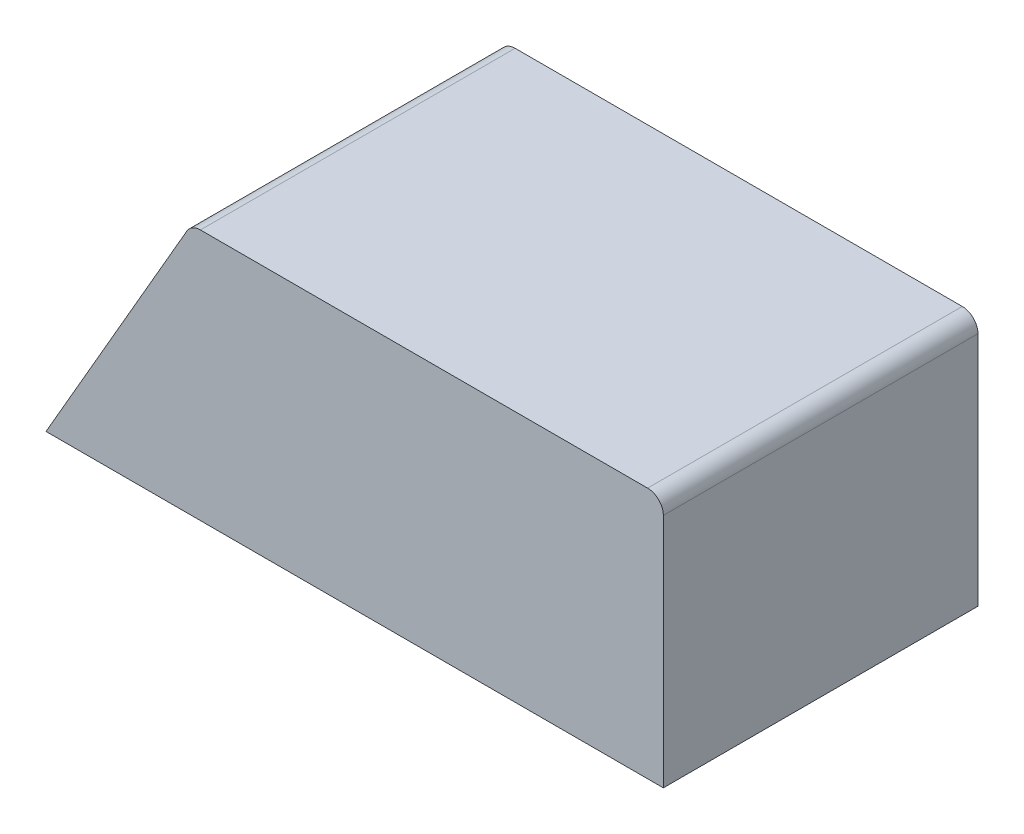
ISO-10303-21;
HEADER;
FILE_DESCRIPTION(('STEP AP214'),'2;1');
FILE_NAME('part.step','',(''),(''),'','','');
FILE_SCHEMA(('AUTOMOTIVE_DESIGN { 1 0 10303 214 1 1 1 1 }'));
ENDSEC;
DATA;
#1=APPLICATION_CONTEXT('core data for automotive mechanical design processes');
#2=APPLICATION_PROTOCOL_DEFINITION('international standard','automotive_design',2000,#1);
#3=PRODUCT_CONTEXT('',#1,'mechanical');
#4=PRODUCT('Part','Part','',(#3));
#5=PRODUCT_RELATED_PRODUCT_CATEGORY('part','',(#4));
#6=PRODUCT_DEFINITION_FORMATION('','',#4);
#7=PRODUCT_DEFINITION_CONTEXT('part definition',#1,'design');
#8=PRODUCT_DEFINITION('design','',#6,#7);
#9=PRODUCT_DEFINITION_SHAPE('','',#8);
#10=(LENGTH_UNIT() NAMED_UNIT(*) SI_UNIT(.MILLI.,.METRE.));
#11=(NAMED_UNIT(*) PLANE_ANGLE_UNIT() SI_UNIT($,.RADIAN.));
#12=(NAMED_UNIT(*) SI_UNIT($,.STERADIAN.) SOLID_ANGLE_UNIT());
#13=UNCERTAINTY_MEASURE_WITH_UNIT(LENGTH_MEASURE(1.E-05),#10,'distance_accuracy_value','');
#14=(GEOMETRIC_REPRESENTATION_CONTEXT(3) GLOBAL_UNCERTAINTY_ASSIGNED_CONTEXT((#13)) GLOBAL_UNIT_ASSIGNED_CONTEXT((#10,
#11,#12)) REPRESENTATION_CONTEXT('',''));
#15=CARTESIAN_POINT('',(0.,0.,0.));
#16=DIRECTION('',(0.,0.,1.));
#17=DIRECTION('',(1.,0.,0.));
#18=AXIS2_PLACEMENT_3D('',#15,#16,#17);
#19=CARTESIAN_POINT('',(-19.618802153517,0.,5.));
#20=DIRECTION('',(0.86602540378444,-0.499999999999998,0.));
#21=DIRECTION('',(0.499999999999998,0.86602540378444,0.));
#22=AXIS2_PLACEMENT_3D('',#19,#20,#21);
#23=PLANE('',#22);
#24=DIRECTION('',(-0.499999999999998,-0.86602540378444,0.));
#25=VECTOR('',#24,1.);
#26=CARTESIAN_POINT('',(-19.618802153517,0.,5.));
#27=LINE('',#26,#25);
#28=CARTESIAN_POINT('',(-15.1443375672974,7.75,5.));
#29=VERTEX_POINT('',#28);
#30=CARTESIAN_POINT('',(-19.618802153517,0.,5.));
#31=VERTEX_POINT('',#30);
#32=EDGE_CURVE('E87',#29,#31,#27,.T.);
#33=ORIENTED_EDGE('',*,*,#32,.F.);
#34=DIRECTION('',(0.,0.,-1.));
#35=VECTOR('',#34,1.);
#36=CARTESIAN_POINT('',(-15.1443375672974,7.75,5.));
#37=LINE('',#36,#35);
#38=CARTESIAN_POINT('',(-15.1443375672974,7.75,-5.));
#39=VERTEX_POINT('',#38);
#40=EDGE_CURVE('E11',#29,#39,#37,.T.);
#41=ORIENTED_EDGE('',*,*,#40,.T.);
#42=DIRECTION('',(-0.499999999999998,-0.86602540378444,0.));
#43=VECTOR('',#42,1.);
#44=CARTESIAN_POINT('',(-19.618802153517,0.,-5.));
#45=LINE('',#44,#43);
#46=CARTESIAN_POINT('',(-19.618802153517,0.,-5.));
#47=VERTEX_POINT('',#46);
#48=EDGE_CURVE('E106',#39,#47,#45,.T.);
#49=ORIENTED_EDGE('',*,*,#48,.T.);
#50=DIRECTION('',(0.,0.,-1.));
#51=VECTOR('',#50,1.);
#52=CARTESIAN_POINT('',(-19.618802153517,0.,5.));
#53=LINE('',#52,#51);
#54=EDGE_CURVE('E100',#31,#47,#53,.T.);
#55=ORIENTED_EDGE('',*,*,#54,.F.);
#56=EDGE_LOOP('',(#33,#41,#49,#55));
#57=FACE_BOUND('',#56,.T.);
#58=ADVANCED_FACE('F34',(#57),#23,.F.);
#59=CARTESIAN_POINT('',(0.,0.,5.));
#60=DIRECTION('',(0.,1.,0.));
#61=DIRECTION('',(-1.,0.,0.));
#62=AXIS2_PLACEMENT_3D('',#59,#60,#61);
#63=PLANE('',#62);
#64=DIRECTION('',(1.,0.,0.));
#65=VECTOR('',#64,1.);
#66=CARTESIAN_POINT('',(0.,0.,-5.));
#67=LINE('',#66,#65);
#68=CARTESIAN_POINT('',(0.,0.,-5.));
#69=VERTEX_POINT('',#68);
#70=EDGE_CURVE('E139',#47,#69,#67,.T.);
#71=ORIENTED_EDGE('',*,*,#70,.T.);
#72=DIRECTION('',(0.,0.,-1.));
#73=VECTOR('',#72,1.);
#74=CARTESIAN_POINT('',(0.,0.,5.));
#75=LINE('',#74,#73);
#76=CARTESIAN_POINT('',(0.,0.,5.));
#77=VERTEX_POINT('',#76);
#78=EDGE_CURVE('E102',#77,#69,#75,.T.);
#79=ORIENTED_EDGE('',*,*,#78,.F.);
#80=DIRECTION('',(1.,0.,0.));
#81=VECTOR('',#80,1.);
#82=CARTESIAN_POINT('',(0.,0.,5.));
#83=LINE('',#82,#81);
#84=EDGE_CURVE('E90',#31,#77,#83,.T.);
#85=ORIENTED_EDGE('',*,*,#84,.F.);
#86=ORIENTED_EDGE('',*,*,#54,.T.);
#87=EDGE_LOOP('',(#71,#79,#85,#86));
#88=FACE_BOUND('',#87,.T.);
#89=ADVANCED_FACE('F99',(#88),#63,.F.);
#90=CARTESIAN_POINT('',(0.,8.,5.));
#91=DIRECTION('',(-1.,0.,0.));
#92=DIRECTION('',(0.,0.,1.));
#93=AXIS2_PLACEMENT_3D('',#90,#91,#92);
#94=PLANE('',#93);
#95=DIRECTION('',(0.,1.,0.));
#96=VECTOR('',#95,1.);
#97=CARTESIAN_POINT('',(0.,8.,-5.));
#98=LINE('',#97,#96);
#99=CARTESIAN_POINT('',(0.,7.5,-5.));
#100=VERTEX_POINT('',#99);
#101=EDGE_CURVE('E137',#69,#100,#98,.T.);
#102=ORIENTED_EDGE('',*,*,#101,.T.);
#103=DIRECTION('',(0.,0.,-1.));
#104=VECTOR('',#103,1.);
#105=CARTESIAN_POINT('',(0.,7.5,5.));
#106=LINE('',#105,#104);
#107=CARTESIAN_POINT('',(0.,7.5,5.));
#108=VERTEX_POINT('',#107);
#109=EDGE_CURVE('E57',#100,#108,#106,.F.);
#110=ORIENTED_EDGE('',*,*,#109,.T.);
#111=DIRECTION('',(0.,1.,0.));
#112=VECTOR('',#111,1.);
#113=CARTESIAN_POINT('',(0.,8.,5.));
#114=LINE('',#113,#112);
#115=EDGE_CURVE('E103',#77,#108,#114,.T.);
#116=ORIENTED_EDGE('',*,*,#115,.F.);
#117=ORIENTED_EDGE('',*,*,#78,.T.);
#118=EDGE_LOOP('',(#102,#110,#116,#117));
#119=FACE_BOUND('',#118,.T.);
#120=ADVANCED_FACE('F138',(#119),#94,.F.);
#121=CARTESIAN_POINT('',(-15.,8.,5.));
#122=DIRECTION('',(0.,-1.,0.));
#123=DIRECTION('',(0.,0.,-1.));
#124=AXIS2_PLACEMENT_3D('',#121,#122,#123);
#125=PLANE('',#124);
#126=DIRECTION('',(-1.,0.,0.));
#127=VECTOR('',#126,1.);
#128=CARTESIAN_POINT('',(-15.,8.,5.));
#129=LINE('',#128,#127);
#130=CARTESIAN_POINT('',(-0.5,8.,5.));
#131=VERTEX_POINT('',#130);
#132=CARTESIAN_POINT('',(-14.7113248654052,8.,5.));
#133=VERTEX_POINT('',#132);
#134=EDGE_CURVE('E112',#131,#133,#129,.T.);
#135=ORIENTED_EDGE('',*,*,#134,.F.);
#136=DIRECTION('',(0.,0.,-1.));
#137=VECTOR('',#136,1.);
#138=CARTESIAN_POINT('',(-0.5,8.,5.));
#139=LINE('',#138,#137);
#140=CARTESIAN_POINT('',(-0.5,8.,-5.));
#141=VERTEX_POINT('',#140);
#142=EDGE_CURVE('E110',#131,#141,#139,.T.);
#143=ORIENTED_EDGE('',*,*,#142,.T.);
#144=DIRECTION('',(-1.,0.,0.));
#145=VECTOR('',#144,1.);
#146=CARTESIAN_POINT('',(-15.,8.,-5.));
#147=LINE('',#146,#145);
#148=CARTESIAN_POINT('',(-14.7113248654052,8.,-5.));
#149=VERTEX_POINT('',#148);
#150=EDGE_CURVE('E95',#141,#149,#147,.T.);
#151=ORIENTED_EDGE('',*,*,#150,.T.);
#152=DIRECTION('',(0.,0.,-1.));
#153=VECTOR('',#152,1.);
#154=CARTESIAN_POINT('',(-14.7113248654052,8.,5.));
#155=LINE('',#154,#153);
#156=EDGE_CURVE('E108',#149,#133,#155,.F.);
#157=ORIENTED_EDGE('',*,*,#156,.T.);
#158=EDGE_LOOP('',(#135,#143,#151,#157));
#159=FACE_BOUND('',#158,.T.);
#160=ADVANCED_FACE('F128',(#159),#125,.F.);
#161=CARTESIAN_POINT('',(0.,0.,5.));
#162=DIRECTION('',(0.,0.,-1.));
#163=DIRECTION('',(-1.,0.,0.));
#164=AXIS2_PLACEMENT_3D('',#161,#162,#163);
#165=PLANE('',#164);
#166=ORIENTED_EDGE('',*,*,#115,.T.);
#167=CARTESIAN_POINT('',(-0.5,7.5,5.));
#168=DIRECTION('',(0.,0.,-1.));
#169=DIRECTION('',(-1.,0.,0.));
#170=AXIS2_PLACEMENT_3D('',#167,#168,#169);
#171=CIRCLE('',#170,0.5);
#172=EDGE_CURVE('E42',#108,#131,#171,.F.);
#173=ORIENTED_EDGE('',*,*,#172,.T.);
#174=ORIENTED_EDGE('',*,*,#134,.T.);
#175=CARTESIAN_POINT('',(-14.7113248654052,7.5,5.));
#176=DIRECTION('',(0.,0.,-1.));
#177=DIRECTION('',(-1.,0.,0.));
#178=AXIS2_PLACEMENT_3D('',#175,#176,#177);
#179=CIRCLE('',#178,0.5);
#180=EDGE_CURVE('E49',#133,#29,#179,.F.);
#181=ORIENTED_EDGE('',*,*,#180,.T.);
#182=ORIENTED_EDGE('',*,*,#32,.T.);
#183=ORIENTED_EDGE('',*,*,#84,.T.);
#184=EDGE_LOOP('',(#166,#173,#174,#181,#182,#183));
#185=FACE_BOUND('',#184,.T.);
#186=ADVANCED_FACE('F89',(#185),#165,.F.);
#187=CARTESIAN_POINT('',(0.,0.,-5.));
#188=DIRECTION('',(0.,0.,-1.));
#189=DIRECTION('',(-1.,0.,0.));
#190=AXIS2_PLACEMENT_3D('',#187,#188,#189);
#191=PLANE('',#190);
#192=ORIENTED_EDGE('',*,*,#150,.F.);
#193=CARTESIAN_POINT('',(-0.5,7.5,-5.));
#194=DIRECTION('',(0.,0.,-1.));
#195=DIRECTION('',(-1.,0.,0.));
#196=AXIS2_PLACEMENT_3D('',#193,#194,#195);
#197=CIRCLE('',#196,0.5);
#198=EDGE_CURVE('E120',#141,#100,#197,.T.);
#199=ORIENTED_EDGE('',*,*,#198,.T.);
#200=ORIENTED_EDGE('',*,*,#101,.F.);
#201=ORIENTED_EDGE('',*,*,#70,.F.);
#202=ORIENTED_EDGE('',*,*,#48,.F.);
#203=CARTESIAN_POINT('',(-14.7113248654052,7.5,-5.));
#204=DIRECTION('',(0.,0.,-1.));
#205=DIRECTION('',(-1.,0.,0.));
#206=AXIS2_PLACEMENT_3D('',#203,#204,#205);
#207=CIRCLE('',#206,0.5);
#208=EDGE_CURVE('E118',#39,#149,#207,.T.);
#209=ORIENTED_EDGE('',*,*,#208,.T.);
#210=EDGE_LOOP('',(#192,#199,#200,#201,#202,#209));
#211=FACE_BOUND('',#210,.T.);
#212=ADVANCED_FACE('F136',(#211),#191,.T.);
#213=CARTESIAN_POINT('',(-0.5,7.5,5.));
#214=DIRECTION('',(0.,0.,-1.));
#215=DIRECTION('',(-1.,0.,0.));
#216=AXIS2_PLACEMENT_3D('',#213,#214,#215);
#217=CYLINDRICAL_SURFACE('',#216,0.5);
#218=ORIENTED_EDGE('',*,*,#172,.F.);
#219=ORIENTED_EDGE('',*,*,#109,.F.);
#220=ORIENTED_EDGE('',*,*,#198,.F.);
#221=ORIENTED_EDGE('',*,*,#142,.F.);
#222=EDGE_LOOP('',(#218,#219,#220,#221));
#223=FACE_BOUND('',#222,.T.);
#224=ADVANCED_FACE('F133',(#223),#217,.T.);
#225=CARTESIAN_POINT('',(-14.7113248654052,7.5,5.));
#226=DIRECTION('',(0.,0.,-1.));
#227=DIRECTION('',(-1.,0.,0.));
#228=AXIS2_PLACEMENT_3D('',#225,#226,#227);
#229=CYLINDRICAL_SURFACE('',#228,0.5);
#230=ORIENTED_EDGE('',*,*,#180,.F.);
#231=ORIENTED_EDGE('',*,*,#156,.F.);
#232=ORIENTED_EDGE('',*,*,#208,.F.);
#233=ORIENTED_EDGE('',*,*,#40,.F.);
#234=EDGE_LOOP('',(#230,#231,#232,#233));
#235=FACE_BOUND('',#234,.T.);
#236=ADVANCED_FACE('F36',(#235),#229,.T.);
#237=CLOSED_SHELL('',(#58,#89,#120,#160,#186,#212,#224,#236));
#238=MANIFOLD_SOLID_BREP('B2',#237);
#239=ADVANCED_BREP_SHAPE_REPRESENTATION('',(#18,#238),#14);
#240=SHAPE_DEFINITION_REPRESENTATION(#9,#239);
ENDSEC;
END-ISO-10303-21;
